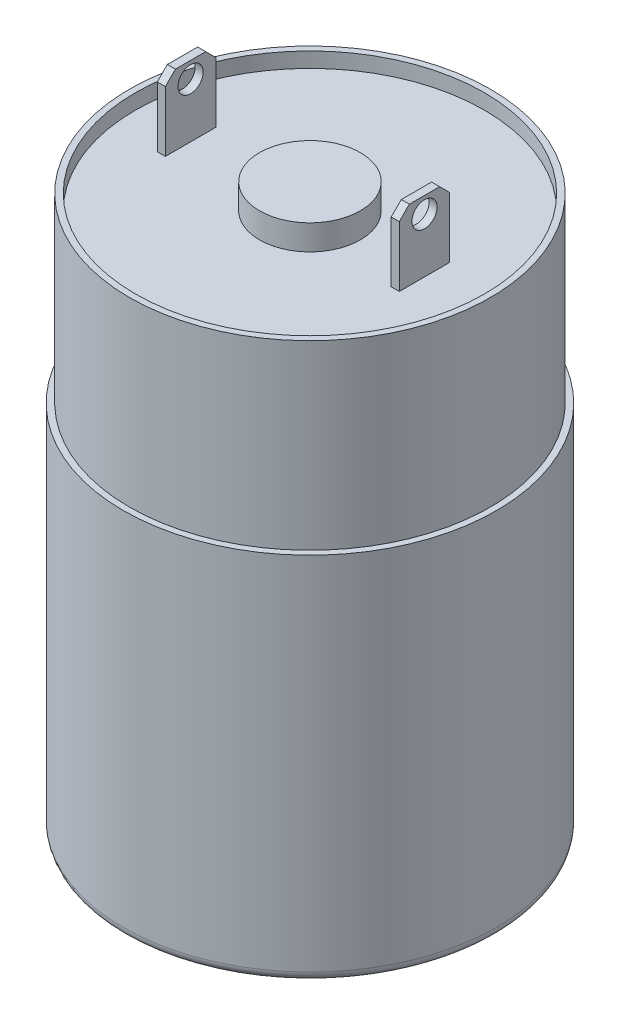
ISO-10303-21;
HEADER;
FILE_DESCRIPTION(('STEP AP214'),'2;1');
FILE_NAME('part.step','',(''),(''),'','','');
FILE_SCHEMA(('AUTOMOTIVE_DESIGN { 1 0 10303 214 1 1 1 1 }'));
ENDSEC;
DATA;
#1=APPLICATION_CONTEXT('core data for automotive mechanical design processes');
#2=APPLICATION_PROTOCOL_DEFINITION('international standard','automotive_design',2000,#1);
#3=PRODUCT_CONTEXT('',#1,'mechanical');
#4=PRODUCT('Part','Part','',(#3));
#5=PRODUCT_RELATED_PRODUCT_CATEGORY('part','',(#4));
#6=PRODUCT_DEFINITION_FORMATION('','',#4);
#7=PRODUCT_DEFINITION_CONTEXT('part definition',#1,'design');
#8=PRODUCT_DEFINITION('design','',#6,#7);
#9=PRODUCT_DEFINITION_SHAPE('','',#8);
#10=(LENGTH_UNIT() NAMED_UNIT(*) SI_UNIT(.MILLI.,.METRE.));
#11=(NAMED_UNIT(*) PLANE_ANGLE_UNIT() SI_UNIT($,.RADIAN.));
#12=(NAMED_UNIT(*) SI_UNIT($,.STERADIAN.) SOLID_ANGLE_UNIT());
#13=UNCERTAINTY_MEASURE_WITH_UNIT(LENGTH_MEASURE(1.E-05),#10,'distance_accuracy_value','');
#14=(GEOMETRIC_REPRESENTATION_CONTEXT(3) GLOBAL_UNCERTAINTY_ASSIGNED_CONTEXT((#13)) GLOBAL_UNIT_ASSIGNED_CONTEXT((#10,
#11,#12)) REPRESENTATION_CONTEXT('',''));
#15=CARTESIAN_POINT('',(0.,0.,0.));
#16=DIRECTION('',(0.,0.,1.));
#17=DIRECTION('',(1.,0.,0.));
#18=AXIS2_PLACEMENT_3D('',#15,#16,#17);
#19=CARTESIAN_POINT('',(0.,18.4,0.));
#20=DIRECTION('',(0.,-1.,0.));
#21=DIRECTION('',(0.,0.,-1.));
#22=AXIS2_PLACEMENT_3D('',#19,#20,#21);
#23=CYLINDRICAL_SURFACE('',#22,18.5);
#24=CARTESIAN_POINT('',(0.,-17.4,0.));
#25=DIRECTION('',(0.,1.,0.));
#26=DIRECTION('',(0.,0.,1.));
#27=AXIS2_PLACEMENT_3D('',#24,#25,#26);
#28=CIRCLE('',#27,18.5);
#29=CARTESIAN_POINT('',(0.,-17.4,18.5));
#30=VERTEX_POINT('',#29);
#31=EDGE_CURVE('E43',#30,#30,#28,.T.);
#32=ORIENTED_EDGE('',*,*,#31,.T.);
#33=EDGE_LOOP('',(#32));
#34=FACE_BOUND('',#33,.T.);
#35=CARTESIAN_POINT('',(0.,18.4,0.));
#36=DIRECTION('',(0.,1.,0.));
#37=DIRECTION('',(0.,0.,1.));
#38=AXIS2_PLACEMENT_3D('',#35,#36,#37);
#39=CIRCLE('',#38,18.5);
#40=CARTESIAN_POINT('',(0.,18.4,18.5));
#41=VERTEX_POINT('',#40);
#42=EDGE_CURVE('E209',#41,#41,#39,.T.);
#43=ORIENTED_EDGE('',*,*,#42,.F.);
#44=EDGE_LOOP('',(#43));
#45=FACE_BOUND('',#44,.T.);
#46=ADVANCED_FACE('F35',(#34,#45),#23,.T.);
#47=CARTESIAN_POINT('',(0.,18.4,0.));
#48=DIRECTION('',(0.,1.,0.));
#49=DIRECTION('',(0.,0.,1.));
#50=AXIS2_PLACEMENT_3D('',#47,#48,#49);
#51=PLANE('',#50);
#52=CARTESIAN_POINT('',(0.,18.4,0.));
#53=DIRECTION('',(0.,1.,0.));
#54=DIRECTION('',(0.,0.,1.));
#55=AXIS2_PLACEMENT_3D('',#52,#53,#54);
#56=CIRCLE('',#55,17.9);
#57=CARTESIAN_POINT('',(0.,18.4,17.9));
#58=VERTEX_POINT('',#57);
#59=EDGE_CURVE('E203',#58,#58,#56,.T.);
#60=ORIENTED_EDGE('',*,*,#59,.F.);
#61=EDGE_LOOP('',(#60));
#62=FACE_BOUND('',#61,.T.);
#63=ORIENTED_EDGE('',*,*,#42,.T.);
#64=EDGE_LOOP('',(#63));
#65=FACE_BOUND('',#64,.T.);
#66=ADVANCED_FACE('F261',(#62,#65),#51,.T.);
#67=CARTESIAN_POINT('',(0.,-18.4,0.));
#68=DIRECTION('',(0.,1.,0.));
#69=DIRECTION('',(0.,0.,1.));
#70=AXIS2_PLACEMENT_3D('',#67,#68,#69);
#71=PLANE('',#70);
#72=CARTESIAN_POINT('',(0.,-18.4,0.));
#73=DIRECTION('',(0.,1.,0.));
#74=DIRECTION('',(0.,0.,1.));
#75=AXIS2_PLACEMENT_3D('',#72,#73,#74);
#76=CIRCLE('',#75,17.5);
#77=CARTESIAN_POINT('',(0.,-18.4,17.5));
#78=VERTEX_POINT('',#77);
#79=EDGE_CURVE('E11',#78,#78,#76,.F.);
#80=ORIENTED_EDGE('',*,*,#79,.T.);
#81=EDGE_LOOP('',(#80));
#82=FACE_BOUND('',#81,.T.);
#83=ADVANCED_FACE('F266',(#82),#71,.F.);
#84=CARTESIAN_POINT('',(0.,36.4,0.));
#85=DIRECTION('',(0.,-1.,0.));
#86=DIRECTION('',(0.,0.,-1.));
#87=AXIS2_PLACEMENT_3D('',#84,#85,#86);
#88=CYLINDRICAL_SURFACE('',#87,17.9);
#89=CARTESIAN_POINT('',(0.,36.4,0.));
#90=DIRECTION('',(0.,1.,0.));
#91=DIRECTION('',(0.,0.,1.));
#92=AXIS2_PLACEMENT_3D('',#89,#90,#91);
#93=CIRCLE('',#92,17.9);
#94=CARTESIAN_POINT('',(0.,36.4,17.9));
#95=VERTEX_POINT('',#94);
#96=EDGE_CURVE('E206',#95,#95,#93,.T.);
#97=ORIENTED_EDGE('',*,*,#96,.F.);
#98=EDGE_LOOP('',(#97));
#99=FACE_BOUND('',#98,.T.);
#100=ORIENTED_EDGE('',*,*,#59,.T.);
#101=EDGE_LOOP('',(#100));
#102=FACE_BOUND('',#101,.T.);
#103=ADVANCED_FACE('F361',(#99,#102),#88,.T.);
#104=CARTESIAN_POINT('',(0.,36.4,0.));
#105=DIRECTION('',(0.,1.,0.));
#106=DIRECTION('',(0.,0.,1.));
#107=AXIS2_PLACEMENT_3D('',#104,#105,#106);
#108=PLANE('',#107);
#109=CARTESIAN_POINT('',(0.,36.4,0.));
#110=DIRECTION('',(0.,1.,0.));
#111=DIRECTION('',(0.,0.,1.));
#112=AXIS2_PLACEMENT_3D('',#109,#110,#111);
#113=CIRCLE('',#112,17.3);
#114=CARTESIAN_POINT('',(0.,36.4,17.3));
#115=VERTEX_POINT('',#114);
#116=EDGE_CURVE('E197',#115,#115,#113,.T.);
#117=ORIENTED_EDGE('',*,*,#116,.F.);
#118=EDGE_LOOP('',(#117));
#119=FACE_BOUND('',#118,.T.);
#120=ORIENTED_EDGE('',*,*,#96,.T.);
#121=EDGE_LOOP('',(#120));
#122=FACE_BOUND('',#121,.T.);
#123=ADVANCED_FACE('F357',(#119,#122),#108,.T.);
#124=CARTESIAN_POINT('',(0.,34.9,0.));
#125=DIRECTION('',(0.,1.,0.));
#126=DIRECTION('',(0.,0.,1.));
#127=AXIS2_PLACEMENT_3D('',#124,#125,#126);
#128=CYLINDRICAL_SURFACE('',#127,17.3);
#129=CARTESIAN_POINT('',(0.,34.9,0.));
#130=DIRECTION('',(0.,1.,0.));
#131=DIRECTION('',(0.,0.,1.));
#132=AXIS2_PLACEMENT_3D('',#129,#130,#131);
#133=CIRCLE('',#132,17.3);
#134=CARTESIAN_POINT('',(0.,34.9,17.3));
#135=VERTEX_POINT('',#134);
#136=EDGE_CURVE('E200',#135,#135,#133,.T.);
#137=ORIENTED_EDGE('',*,*,#136,.F.);
#138=EDGE_LOOP('',(#137));
#139=FACE_BOUND('',#138,.T.);
#140=ORIENTED_EDGE('',*,*,#116,.T.);
#141=EDGE_LOOP('',(#140));
#142=FACE_BOUND('',#141,.T.);
#143=ADVANCED_FACE('F354',(#139,#142),#128,.F.);
#144=CARTESIAN_POINT('',(0.,34.9,0.));
#145=DIRECTION('',(0.,1.,0.));
#146=DIRECTION('',(0.,0.,1.));
#147=AXIS2_PLACEMENT_3D('',#144,#145,#146);
#148=PLANE('',#147);
#149=DIRECTION('',(0.,0.,-1.));
#150=VECTOR('',#149,1.);
#151=CARTESIAN_POINT('',(10.561081130441,34.9,0.));
#152=LINE('',#151,#150);
#153=CARTESIAN_POINT('',(10.561081130441,34.9,2.5));
#154=VERTEX_POINT('',#153);
#155=CARTESIAN_POINT('',(10.561081130441,34.9,-2.5));
#156=VERTEX_POINT('',#155);
#157=EDGE_CURVE('E138',#154,#156,#152,.T.);
#158=ORIENTED_EDGE('',*,*,#157,.T.);
#159=DIRECTION('',(-1.,0.,0.));
#160=VECTOR('',#159,1.);
#161=CARTESIAN_POINT('',(23.2,34.9,-2.5));
#162=LINE('',#161,#160);
#163=CARTESIAN_POINT('',(11.361081130441,34.9,-2.5));
#164=VERTEX_POINT('',#163);
#165=EDGE_CURVE('E151',#164,#156,#162,.T.);
#166=ORIENTED_EDGE('',*,*,#165,.F.);
#167=DIRECTION('',(0.,0.,-1.));
#168=VECTOR('',#167,1.);
#169=CARTESIAN_POINT('',(11.361081130441,34.9,0.));
#170=LINE('',#169,#168);
#171=CARTESIAN_POINT('',(11.361081130441,34.9,2.5));
#172=VERTEX_POINT('',#171);
#173=EDGE_CURVE('E149',#172,#164,#170,.T.);
#174=ORIENTED_EDGE('',*,*,#173,.F.);
#175=DIRECTION('',(-1.,0.,0.));
#176=VECTOR('',#175,1.);
#177=CARTESIAN_POINT('',(23.2,34.9,2.5));
#178=LINE('',#177,#176);
#179=EDGE_CURVE('E130',#172,#154,#178,.T.);
#180=ORIENTED_EDGE('',*,*,#179,.T.);
#181=EDGE_LOOP('',(#158,#166,#174,#180));
#182=FACE_BOUND('',#181,.T.);
#183=DIRECTION('',(0.,0.,-1.));
#184=VECTOR('',#183,1.);
#185=CARTESIAN_POINT('',(-12.638918869559,34.9,0.));
#186=LINE('',#185,#184);
#187=CARTESIAN_POINT('',(-12.638918869559,34.9,2.5));
#188=VERTEX_POINT('',#187);
#189=CARTESIAN_POINT('',(-12.638918869559,34.9,-2.5));
#190=VERTEX_POINT('',#189);
#191=EDGE_CURVE('E167',#188,#190,#186,.T.);
#192=ORIENTED_EDGE('',*,*,#191,.T.);
#193=DIRECTION('',(-1.,0.,0.));
#194=VECTOR('',#193,1.);
#195=CARTESIAN_POINT('',(0.,34.9,-2.5));
#196=LINE('',#195,#194);
#197=CARTESIAN_POINT('',(-11.838918869559,34.9,-2.5));
#198=VERTEX_POINT('',#197);
#199=EDGE_CURVE('E172',#198,#190,#196,.T.);
#200=ORIENTED_EDGE('',*,*,#199,.F.);
#201=DIRECTION('',(0.,0.,-1.));
#202=VECTOR('',#201,1.);
#203=CARTESIAN_POINT('',(-11.838918869559,34.9,0.));
#204=LINE('',#203,#202);
#205=CARTESIAN_POINT('',(-11.838918869559,34.9,2.5));
#206=VERTEX_POINT('',#205);
#207=EDGE_CURVE('E181',#206,#198,#204,.T.);
#208=ORIENTED_EDGE('',*,*,#207,.F.);
#209=DIRECTION('',(-1.,0.,0.));
#210=VECTOR('',#209,1.);
#211=CARTESIAN_POINT('',(0.,34.9,2.5));
#212=LINE('',#211,#210);
#213=EDGE_CURVE('E178',#206,#188,#212,.T.);
#214=ORIENTED_EDGE('',*,*,#213,.T.);
#215=EDGE_LOOP('',(#192,#200,#208,#214));
#216=FACE_BOUND('',#215,.T.);
#217=CARTESIAN_POINT('',(0.,34.9,0.));
#218=DIRECTION('',(0.,1.,0.));
#219=DIRECTION('',(0.,0.,1.));
#220=AXIS2_PLACEMENT_3D('',#217,#218,#219);
#221=CIRCLE('',#220,5.);
#222=CARTESIAN_POINT('',(0.,34.9,5.));
#223=VERTEX_POINT('',#222);
#224=EDGE_CURVE('E193',#223,#223,#221,.T.);
#225=ORIENTED_EDGE('',*,*,#224,.F.);
#226=EDGE_LOOP('',(#225));
#227=FACE_BOUND('',#226,.T.);
#228=ORIENTED_EDGE('',*,*,#136,.T.);
#229=EDGE_LOOP('',(#228));
#230=FACE_BOUND('',#229,.T.);
#231=ADVANCED_FACE('F146',(#182,#216,#227,#230),#148,.T.);
#232=CARTESIAN_POINT('',(0.,37.4,0.));
#233=DIRECTION('',(0.,-1.,0.));
#234=DIRECTION('',(0.,0.,-1.));
#235=AXIS2_PLACEMENT_3D('',#232,#233,#234);
#236=CYLINDRICAL_SURFACE('',#235,5.);
#237=CARTESIAN_POINT('',(0.,37.4,0.));
#238=DIRECTION('',(0.,1.,0.));
#239=DIRECTION('',(0.,0.,1.));
#240=AXIS2_PLACEMENT_3D('',#237,#238,#239);
#241=CIRCLE('',#240,5.);
#242=CARTESIAN_POINT('',(0.,37.4,5.));
#243=VERTEX_POINT('',#242);
#244=EDGE_CURVE('E194',#243,#243,#241,.T.);
#245=ORIENTED_EDGE('',*,*,#244,.F.);
#246=EDGE_LOOP('',(#245));
#247=FACE_BOUND('',#246,.T.);
#248=ORIENTED_EDGE('',*,*,#224,.T.);
#249=EDGE_LOOP('',(#248));
#250=FACE_BOUND('',#249,.T.);
#251=ADVANCED_FACE('F347',(#247,#250),#236,.T.);
#252=CARTESIAN_POINT('',(0.,37.4,0.));
#253=DIRECTION('',(0.,1.,0.));
#254=DIRECTION('',(0.,0.,1.));
#255=AXIS2_PLACEMENT_3D('',#252,#253,#254);
#256=PLANE('',#255);
#257=ORIENTED_EDGE('',*,*,#244,.T.);
#258=EDGE_LOOP('',(#257));
#259=FACE_BOUND('',#258,.T.);
#260=ADVANCED_FACE('F343',(#259),#256,.T.);
#261=CARTESIAN_POINT('',(-12.638918869559,41.9,0.));
#262=DIRECTION('',(-1.,0.,0.));
#263=DIRECTION('',(0.,0.,1.));
#264=AXIS2_PLACEMENT_3D('',#261,#262,#263);
#265=PLANE('',#264);
#266=CARTESIAN_POINT('',(-12.638918869559,40.2854740989314,0.));
#267=DIRECTION('',(-1.,0.,0.));
#268=DIRECTION('',(0.,0.,1.));
#269=AXIS2_PLACEMENT_3D('',#266,#267,#268);
#270=CIRCLE('',#269,1.25);
#271=CARTESIAN_POINT('',(-12.638918869559,40.2854740989314,1.25));
#272=VERTEX_POINT('',#271);
#273=EDGE_CURVE('E164',#272,#272,#270,.T.);
#274=ORIENTED_EDGE('',*,*,#273,.F.);
#275=EDGE_LOOP('',(#274));
#276=FACE_BOUND('',#275,.T.);
#277=DIRECTION('',(0.,0.,-1.));
#278=VECTOR('',#277,1.);
#279=CARTESIAN_POINT('',(-12.638918869559,41.9,0.));
#280=LINE('',#279,#278);
#281=CARTESIAN_POINT('',(-12.638918869559,41.9,1.5));
#282=VERTEX_POINT('',#281);
#283=CARTESIAN_POINT('',(-12.638918869559,41.9,-1.5));
#284=VERTEX_POINT('',#283);
#285=EDGE_CURVE('E168',#282,#284,#280,.T.);
#286=ORIENTED_EDGE('',*,*,#285,.T.);
#287=DIRECTION('',(0.,-0.70710678118655,-0.707106781186545));
#288=VECTOR('',#287,1.);
#289=CARTESIAN_POINT('',(-12.638918869559,42.65,-0.750000000000005));
#290=LINE('',#289,#288);
#291=CARTESIAN_POINT('',(-12.638918869559,40.9,-2.5));
#292=VERTEX_POINT('',#291);
#293=EDGE_CURVE('E226',#284,#292,#290,.T.);
#294=ORIENTED_EDGE('',*,*,#293,.T.);
#295=DIRECTION('',(0.,-1.,0.));
#296=VECTOR('',#295,1.);
#297=CARTESIAN_POINT('',(-12.638918869559,41.9,-2.5));
#298=LINE('',#297,#296);
#299=EDGE_CURVE('E175',#292,#190,#298,.T.);
#300=ORIENTED_EDGE('',*,*,#299,.T.);
#301=ORIENTED_EDGE('',*,*,#191,.F.);
#302=DIRECTION('',(0.,-1.,0.));
#303=VECTOR('',#302,1.);
#304=CARTESIAN_POINT('',(-12.638918869559,41.9,2.5));
#305=LINE('',#304,#303);
#306=CARTESIAN_POINT('',(-12.638918869559,40.9,2.5));
#307=VERTEX_POINT('',#306);
#308=EDGE_CURVE('E191',#307,#188,#305,.T.);
#309=ORIENTED_EDGE('',*,*,#308,.F.);
#310=DIRECTION('',(0.,-0.707106781186543,0.707106781186552));
#311=VECTOR('',#310,1.);
#312=CARTESIAN_POINT('',(-12.638918869559,42.65,0.749999999999989));
#313=LINE('',#312,#311);
#314=EDGE_CURVE('E217',#307,#282,#313,.F.);
#315=ORIENTED_EDGE('',*,*,#314,.T.);
#316=EDGE_LOOP('',(#286,#294,#300,#301,#309,#315));
#317=FACE_BOUND('',#316,.T.);
#318=ADVANCED_FACE('F339',(#276,#317),#265,.T.);
#319=CARTESIAN_POINT('',(0.,41.9,2.5));
#320=DIRECTION('',(0.,0.,1.));
#321=DIRECTION('',(1.,0.,0.));
#322=AXIS2_PLACEMENT_3D('',#319,#320,#321);
#323=PLANE('',#322);
#324=DIRECTION('',(0.,-1.,0.));
#325=VECTOR('',#324,1.);
#326=CARTESIAN_POINT('',(-11.838918869559,41.9,2.5));
#327=LINE('',#326,#325);
#328=CARTESIAN_POINT('',(-11.838918869559,40.9,2.5));
#329=VERTEX_POINT('',#328);
#330=EDGE_CURVE('E189',#329,#206,#327,.T.);
#331=ORIENTED_EDGE('',*,*,#330,.F.);
#332=DIRECTION('',(-1.,0.,0.));
#333=VECTOR('',#332,1.);
#334=CARTESIAN_POINT('',(0.,40.9,2.5));
#335=LINE('',#334,#333);
#336=EDGE_CURVE('E214',#329,#307,#335,.T.);
#337=ORIENTED_EDGE('',*,*,#336,.T.);
#338=ORIENTED_EDGE('',*,*,#308,.T.);
#339=ORIENTED_EDGE('',*,*,#213,.F.);
#340=EDGE_LOOP('',(#331,#337,#338,#339));
#341=FACE_BOUND('',#340,.T.);
#342=ADVANCED_FACE('F335',(#341),#323,.T.);
#343=CARTESIAN_POINT('',(-11.838918869559,41.9,0.));
#344=DIRECTION('',(-1.,0.,0.));
#345=DIRECTION('',(0.,0.,1.));
#346=AXIS2_PLACEMENT_3D('',#343,#344,#345);
#347=PLANE('',#346);
#348=CARTESIAN_POINT('',(-11.838918869559,40.2854740989314,0.));
#349=DIRECTION('',(1.,0.,0.));
#350=DIRECTION('',(0.,0.,-1.));
#351=AXIS2_PLACEMENT_3D('',#348,#349,#350);
#352=CIRCLE('',#351,1.25);
#353=CARTESIAN_POINT('',(-11.838918869559,40.2854740989314,-1.25));
#354=VERTEX_POINT('',#353);
#355=EDGE_CURVE('E134',#354,#354,#352,.T.);
#356=ORIENTED_EDGE('',*,*,#355,.F.);
#357=EDGE_LOOP('',(#356));
#358=FACE_BOUND('',#357,.T.);
#359=DIRECTION('',(0.,-1.,0.));
#360=VECTOR('',#359,1.);
#361=CARTESIAN_POINT('',(-11.838918869559,41.9,-2.5));
#362=LINE('',#361,#360);
#363=CARTESIAN_POINT('',(-11.838918869559,40.9,-2.5));
#364=VERTEX_POINT('',#363);
#365=EDGE_CURVE('E187',#364,#198,#362,.T.);
#366=ORIENTED_EDGE('',*,*,#365,.F.);
#367=DIRECTION('',(0.,0.70710678118655,0.707106781186545));
#368=VECTOR('',#367,1.);
#369=CARTESIAN_POINT('',(-11.838918869559,41.9,-1.5));
#370=LINE('',#369,#368);
#371=CARTESIAN_POINT('',(-11.838918869559,41.9,-1.5));
#372=VERTEX_POINT('',#371);
#373=EDGE_CURVE('E230',#364,#372,#370,.T.);
#374=ORIENTED_EDGE('',*,*,#373,.T.);
#375=DIRECTION('',(0.,0.,-1.));
#376=VECTOR('',#375,1.);
#377=CARTESIAN_POINT('',(-11.838918869559,41.9,0.));
#378=LINE('',#377,#376);
#379=CARTESIAN_POINT('',(-11.838918869559,41.9,1.5));
#380=VERTEX_POINT('',#379);
#381=EDGE_CURVE('E171',#380,#372,#378,.T.);
#382=ORIENTED_EDGE('',*,*,#381,.F.);
#383=DIRECTION('',(0.,0.707106781186543,-0.707106781186552));
#384=VECTOR('',#383,1.);
#385=CARTESIAN_POINT('',(-11.838918869559,40.9,2.5));
#386=LINE('',#385,#384);
#387=EDGE_CURVE('E221',#380,#329,#386,.F.);
#388=ORIENTED_EDGE('',*,*,#387,.T.);
#389=ORIENTED_EDGE('',*,*,#330,.T.);
#390=ORIENTED_EDGE('',*,*,#207,.T.);
#391=EDGE_LOOP('',(#366,#374,#382,#388,#389,#390));
#392=FACE_BOUND('',#391,.T.);
#393=ADVANCED_FACE('F331',(#358,#392),#347,.F.);
#394=CARTESIAN_POINT('',(0.,41.9,-2.5));
#395=DIRECTION('',(0.,0.,1.));
#396=DIRECTION('',(1.,0.,0.));
#397=AXIS2_PLACEMENT_3D('',#394,#395,#396);
#398=PLANE('',#397);
#399=ORIENTED_EDGE('',*,*,#299,.F.);
#400=DIRECTION('',(1.,0.,0.));
#401=VECTOR('',#400,1.);
#402=CARTESIAN_POINT('',(-11.838918869559,40.9,-2.5));
#403=LINE('',#402,#401);
#404=EDGE_CURVE('E228',#292,#364,#403,.T.);
#405=ORIENTED_EDGE('',*,*,#404,.T.);
#406=ORIENTED_EDGE('',*,*,#365,.T.);
#407=ORIENTED_EDGE('',*,*,#199,.T.);
#408=EDGE_LOOP('',(#399,#405,#406,#407));
#409=FACE_BOUND('',#408,.T.);
#410=ADVANCED_FACE('F327',(#409),#398,.F.);
#411=CARTESIAN_POINT('',(0.,41.9,0.));
#412=DIRECTION('',(0.,1.,0.));
#413=DIRECTION('',(0.,0.,1.));
#414=AXIS2_PLACEMENT_3D('',#411,#412,#413);
#415=PLANE('',#414);
#416=ORIENTED_EDGE('',*,*,#381,.T.);
#417=DIRECTION('',(-1.,0.,0.));
#418=VECTOR('',#417,1.);
#419=CARTESIAN_POINT('',(-12.638918869559,41.9,-1.5));
#420=LINE('',#419,#418);
#421=EDGE_CURVE('E223',#372,#284,#420,.T.);
#422=ORIENTED_EDGE('',*,*,#421,.T.);
#423=ORIENTED_EDGE('',*,*,#285,.F.);
#424=DIRECTION('',(1.,0.,0.));
#425=VECTOR('',#424,1.);
#426=CARTESIAN_POINT('',(0.,41.9,1.5));
#427=LINE('',#426,#425);
#428=EDGE_CURVE('E219',#282,#380,#427,.T.);
#429=ORIENTED_EDGE('',*,*,#428,.T.);
#430=EDGE_LOOP('',(#416,#422,#423,#429));
#431=FACE_BOUND('',#430,.T.);
#432=ADVANCED_FACE('F275',(#431),#415,.T.);
#433=CARTESIAN_POINT('',(0.,40.9,2.5));
#434=DIRECTION('',(0.,-0.707106781186552,-0.707106781186543));
#435=DIRECTION('',(-1.,0.,0.));
#436=AXIS2_PLACEMENT_3D('',#433,#434,#435);
#437=PLANE('',#436);
#438=ORIENTED_EDGE('',*,*,#387,.F.);
#439=ORIENTED_EDGE('',*,*,#428,.F.);
#440=ORIENTED_EDGE('',*,*,#314,.F.);
#441=ORIENTED_EDGE('',*,*,#336,.F.);
#442=EDGE_LOOP('',(#438,#439,#440,#441));
#443=FACE_BOUND('',#442,.T.);
#444=ADVANCED_FACE('F271',(#443),#437,.F.);
#445=CARTESIAN_POINT('',(0.,41.9,-1.5));
#446=DIRECTION('',(0.,0.707106781186545,-0.70710678118655));
#447=DIRECTION('',(1.,0.,0.));
#448=AXIS2_PLACEMENT_3D('',#445,#446,#447);
#449=PLANE('',#448);
#450=ORIENTED_EDGE('',*,*,#373,.F.);
#451=ORIENTED_EDGE('',*,*,#404,.F.);
#452=ORIENTED_EDGE('',*,*,#293,.F.);
#453=ORIENTED_EDGE('',*,*,#421,.F.);
#454=EDGE_LOOP('',(#450,#451,#452,#453));
#455=FACE_BOUND('',#454,.T.);
#456=ADVANCED_FACE('F274',(#455),#449,.T.);
#457=CARTESIAN_POINT('',(-18.838918869559,40.2854740989314,0.));
#458=DIRECTION('',(1.,0.,0.));
#459=DIRECTION('',(0.,0.,-1.));
#460=AXIS2_PLACEMENT_3D('',#457,#458,#459);
#461=CYLINDRICAL_SURFACE('',#460,1.25);
#462=ORIENTED_EDGE('',*,*,#273,.T.);
#463=EDGE_LOOP('',(#462));
#464=FACE_BOUND('',#463,.T.);
#465=ORIENTED_EDGE('',*,*,#355,.T.);
#466=EDGE_LOOP('',(#465));
#467=FACE_BOUND('',#466,.T.);
#468=ADVANCED_FACE('F279',(#464,#467),#461,.F.);
#469=CARTESIAN_POINT('',(10.561081130441,41.9,0.));
#470=DIRECTION('',(-1.,0.,0.));
#471=DIRECTION('',(0.,0.,1.));
#472=AXIS2_PLACEMENT_3D('',#469,#470,#471);
#473=PLANE('',#472);
#474=CARTESIAN_POINT('',(10.561081130441,40.2854740989314,0.));
#475=DIRECTION('',(-1.,0.,0.));
#476=DIRECTION('',(0.,0.,1.));
#477=AXIS2_PLACEMENT_3D('',#474,#475,#476);
#478=CIRCLE('',#477,1.25);
#479=CARTESIAN_POINT('',(10.561081130441,40.2854740989314,1.25));
#480=VERTEX_POINT('',#479);
#481=EDGE_CURVE('E144',#480,#480,#478,.T.);
#482=ORIENTED_EDGE('',*,*,#481,.F.);
#483=EDGE_LOOP('',(#482));
#484=FACE_BOUND('',#483,.T.);
#485=DIRECTION('',(0.,0.,-1.));
#486=VECTOR('',#485,1.);
#487=CARTESIAN_POINT('',(10.561081130441,41.9,0.));
#488=LINE('',#487,#486);
#489=CARTESIAN_POINT('',(10.561081130441,41.9,1.5));
#490=VERTEX_POINT('',#489);
#491=CARTESIAN_POINT('',(10.561081130441,41.9,-1.5));
#492=VERTEX_POINT('',#491);
#493=EDGE_CURVE('E156',#490,#492,#488,.T.);
#494=ORIENTED_EDGE('',*,*,#493,.T.);
#495=DIRECTION('',(0.,-0.70710678118655,-0.707106781186545));
#496=VECTOR('',#495,1.);
#497=CARTESIAN_POINT('',(10.561081130441,42.65,-0.750000000000005));
#498=LINE('',#497,#496);
#499=CARTESIAN_POINT('',(10.561081130441,40.9,-2.5));
#500=VERTEX_POINT('',#499);
#501=EDGE_CURVE('E58',#492,#500,#498,.T.);
#502=ORIENTED_EDGE('',*,*,#501,.T.);
#503=DIRECTION('',(0.,-1.,0.));
#504=VECTOR('',#503,1.);
#505=CARTESIAN_POINT('',(10.561081130441,41.9,-2.5));
#506=LINE('',#505,#504);
#507=EDGE_CURVE('E140',#500,#156,#506,.T.);
#508=ORIENTED_EDGE('',*,*,#507,.T.);
#509=ORIENTED_EDGE('',*,*,#157,.F.);
#510=DIRECTION('',(0.,-1.,0.));
#511=VECTOR('',#510,1.);
#512=CARTESIAN_POINT('',(10.561081130441,41.9,2.5));
#513=LINE('',#512,#511);
#514=CARTESIAN_POINT('',(10.561081130441,40.9,2.5));
#515=VERTEX_POINT('',#514);
#516=EDGE_CURVE('E125',#515,#154,#513,.T.);
#517=ORIENTED_EDGE('',*,*,#516,.F.);
#518=DIRECTION('',(0.,-0.707106781186543,0.707106781186552));
#519=VECTOR('',#518,1.);
#520=CARTESIAN_POINT('',(10.561081130441,42.65,0.749999999999989));
#521=LINE('',#520,#519);
#522=EDGE_CURVE('E233',#515,#490,#521,.F.);
#523=ORIENTED_EDGE('',*,*,#522,.T.);
#524=EDGE_LOOP('',(#494,#502,#508,#509,#517,#523));
#525=FACE_BOUND('',#524,.T.);
#526=ADVANCED_FACE('F139',(#484,#525),#473,.T.);
#527=CARTESIAN_POINT('',(23.2,41.9,2.5));
#528=DIRECTION('',(0.,0.,1.));
#529=DIRECTION('',(1.,0.,0.));
#530=AXIS2_PLACEMENT_3D('',#527,#528,#529);
#531=PLANE('',#530);
#532=DIRECTION('',(0.,-1.,0.));
#533=VECTOR('',#532,1.);
#534=CARTESIAN_POINT('',(11.361081130441,41.9,2.5));
#535=LINE('',#534,#533);
#536=CARTESIAN_POINT('',(11.361081130441,40.9,2.5));
#537=VERTEX_POINT('',#536);
#538=EDGE_CURVE('E135',#537,#172,#535,.T.);
#539=ORIENTED_EDGE('',*,*,#538,.F.);
#540=DIRECTION('',(-1.,0.,0.));
#541=VECTOR('',#540,1.);
#542=CARTESIAN_POINT('',(23.2,40.9,2.5));
#543=LINE('',#542,#541);
#544=EDGE_CURVE('E133',#537,#515,#543,.T.);
#545=ORIENTED_EDGE('',*,*,#544,.T.);
#546=ORIENTED_EDGE('',*,*,#516,.T.);
#547=ORIENTED_EDGE('',*,*,#179,.F.);
#548=EDGE_LOOP('',(#539,#545,#546,#547));
#549=FACE_BOUND('',#548,.T.);
#550=ADVANCED_FACE('F128',(#549),#531,.T.);
#551=CARTESIAN_POINT('',(11.361081130441,41.9,0.));
#552=DIRECTION('',(-1.,0.,0.));
#553=DIRECTION('',(0.,0.,1.));
#554=AXIS2_PLACEMENT_3D('',#551,#552,#553);
#555=PLANE('',#554);
#556=CARTESIAN_POINT('',(11.361081130441,40.2854740989314,0.));
#557=DIRECTION('',(1.,0.,0.));
#558=DIRECTION('',(0.,0.,-1.));
#559=AXIS2_PLACEMENT_3D('',#556,#557,#558);
#560=CIRCLE('',#559,1.25);
#561=CARTESIAN_POINT('',(11.361081130441,40.2854740989314,-1.25));
#562=VERTEX_POINT('',#561);
#563=EDGE_CURVE('E303',#562,#562,#560,.T.);
#564=ORIENTED_EDGE('',*,*,#563,.F.);
#565=EDGE_LOOP('',(#564));
#566=FACE_BOUND('',#565,.T.);
#567=DIRECTION('',(0.,-1.,0.));
#568=VECTOR('',#567,1.);
#569=CARTESIAN_POINT('',(11.361081130441,41.9,-2.5));
#570=LINE('',#569,#568);
#571=CARTESIAN_POINT('',(11.361081130441,40.9,-2.5));
#572=VERTEX_POINT('',#571);
#573=EDGE_CURVE('E158',#572,#164,#570,.T.);
#574=ORIENTED_EDGE('',*,*,#573,.F.);
#575=DIRECTION('',(0.,0.70710678118655,0.707106781186545));
#576=VECTOR('',#575,1.);
#577=CARTESIAN_POINT('',(11.361081130441,41.9,-1.5));
#578=LINE('',#577,#576);
#579=CARTESIAN_POINT('',(11.361081130441,41.9,-1.5));
#580=VERTEX_POINT('',#579);
#581=EDGE_CURVE('E244',#572,#580,#578,.T.);
#582=ORIENTED_EDGE('',*,*,#581,.T.);
#583=DIRECTION('',(0.,0.,-1.));
#584=VECTOR('',#583,1.);
#585=CARTESIAN_POINT('',(11.361081130441,41.9,0.));
#586=LINE('',#585,#584);
#587=CARTESIAN_POINT('',(11.361081130441,41.9,1.5));
#588=VERTEX_POINT('',#587);
#589=EDGE_CURVE('E159',#588,#580,#586,.T.);
#590=ORIENTED_EDGE('',*,*,#589,.F.);
#591=DIRECTION('',(0.,0.707106781186543,-0.707106781186552));
#592=VECTOR('',#591,1.);
#593=CARTESIAN_POINT('',(11.361081130441,40.9,2.5));
#594=LINE('',#593,#592);
#595=EDGE_CURVE('E237',#588,#537,#594,.F.);
#596=ORIENTED_EDGE('',*,*,#595,.T.);
#597=ORIENTED_EDGE('',*,*,#538,.T.);
#598=ORIENTED_EDGE('',*,*,#173,.T.);
#599=EDGE_LOOP('',(#574,#582,#590,#596,#597,#598));
#600=FACE_BOUND('',#599,.T.);
#601=ADVANCED_FACE('F294',(#566,#600),#555,.F.);
#602=CARTESIAN_POINT('',(23.2,41.9,-2.5));
#603=DIRECTION('',(0.,0.,1.));
#604=DIRECTION('',(1.,0.,0.));
#605=AXIS2_PLACEMENT_3D('',#602,#603,#604);
#606=PLANE('',#605);
#607=ORIENTED_EDGE('',*,*,#507,.F.);
#608=DIRECTION('',(1.,0.,0.));
#609=VECTOR('',#608,1.);
#610=CARTESIAN_POINT('',(11.361081130441,40.9,-2.5));
#611=LINE('',#610,#609);
#612=EDGE_CURVE('E50',#500,#572,#611,.T.);
#613=ORIENTED_EDGE('',*,*,#612,.T.);
#614=ORIENTED_EDGE('',*,*,#573,.T.);
#615=ORIENTED_EDGE('',*,*,#165,.T.);
#616=EDGE_LOOP('',(#607,#613,#614,#615));
#617=FACE_BOUND('',#616,.T.);
#618=ADVANCED_FACE('F309',(#617),#606,.F.);
#619=CARTESIAN_POINT('',(23.2,41.9,0.));
#620=DIRECTION('',(0.,1.,0.));
#621=DIRECTION('',(0.,0.,1.));
#622=AXIS2_PLACEMENT_3D('',#619,#620,#621);
#623=PLANE('',#622);
#624=ORIENTED_EDGE('',*,*,#589,.T.);
#625=DIRECTION('',(-1.,0.,0.));
#626=VECTOR('',#625,1.);
#627=CARTESIAN_POINT('',(10.561081130441,41.9,-1.5));
#628=LINE('',#627,#626);
#629=EDGE_CURVE('E239',#580,#492,#628,.T.);
#630=ORIENTED_EDGE('',*,*,#629,.T.);
#631=ORIENTED_EDGE('',*,*,#493,.F.);
#632=DIRECTION('',(1.,0.,0.));
#633=VECTOR('',#632,1.);
#634=CARTESIAN_POINT('',(23.2,41.9,1.5));
#635=LINE('',#634,#633);
#636=EDGE_CURVE('E235',#490,#588,#635,.T.);
#637=ORIENTED_EDGE('',*,*,#636,.T.);
#638=EDGE_LOOP('',(#624,#630,#631,#637));
#639=FACE_BOUND('',#638,.T.);
#640=ADVANCED_FACE('F283',(#639),#623,.T.);
#641=CARTESIAN_POINT('',(23.2,40.9,2.5));
#642=DIRECTION('',(0.,-0.707106781186552,-0.707106781186543));
#643=DIRECTION('',(-1.,0.,0.));
#644=AXIS2_PLACEMENT_3D('',#641,#642,#643);
#645=PLANE('',#644);
#646=ORIENTED_EDGE('',*,*,#595,.F.);
#647=ORIENTED_EDGE('',*,*,#636,.F.);
#648=ORIENTED_EDGE('',*,*,#522,.F.);
#649=ORIENTED_EDGE('',*,*,#544,.F.);
#650=EDGE_LOOP('',(#646,#647,#648,#649));
#651=FACE_BOUND('',#650,.T.);
#652=ADVANCED_FACE('F281',(#651),#645,.F.);
#653=CARTESIAN_POINT('',(23.2,41.9,-1.5));
#654=DIRECTION('',(0.,0.707106781186545,-0.70710678118655));
#655=DIRECTION('',(1.,0.,0.));
#656=AXIS2_PLACEMENT_3D('',#653,#654,#655);
#657=PLANE('',#656);
#658=ORIENTED_EDGE('',*,*,#581,.F.);
#659=ORIENTED_EDGE('',*,*,#612,.F.);
#660=ORIENTED_EDGE('',*,*,#501,.F.);
#661=ORIENTED_EDGE('',*,*,#629,.F.);
#662=EDGE_LOOP('',(#658,#659,#660,#661));
#663=FACE_BOUND('',#662,.T.);
#664=ADVANCED_FACE('F256',(#663),#657,.T.);
#665=CARTESIAN_POINT('',(4.36108113044101,40.2854740989314,0.));
#666=DIRECTION('',(1.,0.,0.));
#667=DIRECTION('',(0.,0.,-1.));
#668=AXIS2_PLACEMENT_3D('',#665,#666,#667);
#669=CYLINDRICAL_SURFACE('',#668,1.25);
#670=ORIENTED_EDGE('',*,*,#481,.T.);
#671=EDGE_LOOP('',(#670));
#672=FACE_BOUND('',#671,.T.);
#673=ORIENTED_EDGE('',*,*,#563,.T.);
#674=EDGE_LOOP('',(#673));
#675=FACE_BOUND('',#674,.T.);
#676=ADVANCED_FACE('F251',(#672,#675),#669,.F.);
#677=CARTESIAN_POINT('',(0.,-17.4,0.));
#678=DIRECTION('',(0.,1.,0.));
#679=DIRECTION('',(0.,0.,1.));
#680=AXIS2_PLACEMENT_3D('',#677,#678,#679);
#681=TOROIDAL_SURFACE('',#680,17.5,1.);
#682=ORIENTED_EDGE('',*,*,#79,.F.);
#683=EDGE_LOOP('',(#682));
#684=FACE_BOUND('',#683,.T.);
#685=ORIENTED_EDGE('',*,*,#31,.F.);
#686=EDGE_LOOP('',(#685));
#687=FACE_BOUND('',#686,.T.);
#688=ADVANCED_FACE('F37',(#684,#687),#681,.T.);
#689=CLOSED_SHELL('',(#46,#66,#83,#103,#123,#143,#231,#251,#260,#318,#342,#393,#410,#432,#444,
#456,#468,#526,#550,#601,#618,#640,#652,#664,#676,#688));
#690=MANIFOLD_SOLID_BREP('B2',#689);
#691=ADVANCED_BREP_SHAPE_REPRESENTATION('',(#18,#690),#14);
#692=SHAPE_DEFINITION_REPRESENTATION(#9,#691);
ENDSEC;
END-ISO-10303-21;
